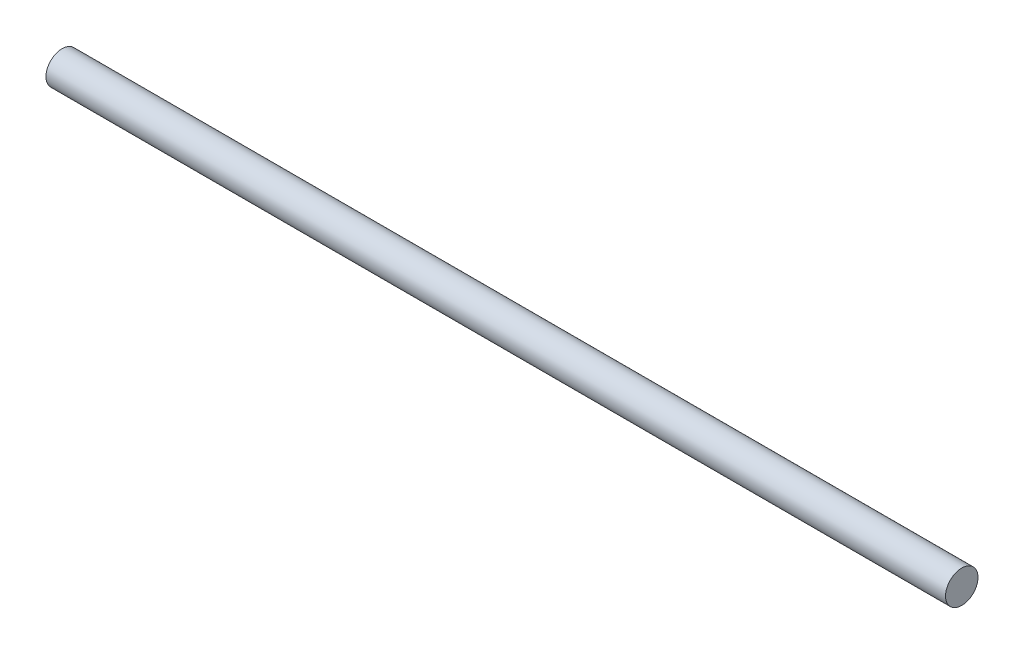
ISO-10303-21;
HEADER;
FILE_DESCRIPTION(('STEP AP214'),'2;1');
FILE_NAME('part.step','',(''),(''),'','','');
FILE_SCHEMA(('AUTOMOTIVE_DESIGN { 1 0 10303 214 1 1 1 1 }'));
ENDSEC;
DATA;
#1=APPLICATION_CONTEXT('core data for automotive mechanical design processes');
#2=APPLICATION_PROTOCOL_DEFINITION('international standard','automotive_design',2000,#1);
#3=PRODUCT_CONTEXT('',#1,'mechanical');
#4=PRODUCT('Part','Part','',(#3));
#5=PRODUCT_RELATED_PRODUCT_CATEGORY('part','',(#4));
#6=PRODUCT_DEFINITION_FORMATION('','',#4);
#7=PRODUCT_DEFINITION_CONTEXT('part definition',#1,'design');
#8=PRODUCT_DEFINITION('design','',#6,#7);
#9=PRODUCT_DEFINITION_SHAPE('','',#8);
#10=(LENGTH_UNIT() NAMED_UNIT(*) SI_UNIT(.MILLI.,.METRE.));
#11=(NAMED_UNIT(*) PLANE_ANGLE_UNIT() SI_UNIT($,.RADIAN.));
#12=(NAMED_UNIT(*) SI_UNIT($,.STERADIAN.) SOLID_ANGLE_UNIT());
#13=UNCERTAINTY_MEASURE_WITH_UNIT(LENGTH_MEASURE(1.E-05),#10,'distance_accuracy_value','');
#14=(GEOMETRIC_REPRESENTATION_CONTEXT(3) GLOBAL_UNCERTAINTY_ASSIGNED_CONTEXT((#13)) GLOBAL_UNIT_ASSIGNED_CONTEXT((#10,
#11,#12)) REPRESENTATION_CONTEXT('',''));
#15=CARTESIAN_POINT('',(0.,0.,0.));
#16=DIRECTION('',(0.,0.,1.));
#17=DIRECTION('',(1.,0.,0.));
#18=AXIS2_PLACEMENT_3D('',#15,#16,#17);
#19=CARTESIAN_POINT('',(1168.4,0.,0.));
#20=DIRECTION('',(-1.,0.,0.));
#21=DIRECTION('',(0.,0.,1.));
#22=AXIS2_PLACEMENT_3D('',#19,#20,#21);
#23=CYLINDRICAL_SURFACE('',#22,21.082);
#24=CARTESIAN_POINT('',(1168.4,0.,0.));
#25=DIRECTION('',(1.,0.,0.));
#26=DIRECTION('',(0.,0.,-1.));
#27=AXIS2_PLACEMENT_3D('',#24,#25,#26);
#28=CIRCLE('',#27,21.082);
#29=CARTESIAN_POINT('',(1168.4,0.,-21.082));
#30=VERTEX_POINT('',#29);
#31=EDGE_CURVE('E10',#30,#30,#28,.T.);
#32=ORIENTED_EDGE('',*,*,#31,.F.);
#33=EDGE_LOOP('',(#32));
#34=FACE_BOUND('',#33,.T.);
#35=CARTESIAN_POINT('',(0.,0.,0.));
#36=DIRECTION('',(1.,0.,0.));
#37=DIRECTION('',(0.,0.,-1.));
#38=AXIS2_PLACEMENT_3D('',#35,#36,#37);
#39=CIRCLE('',#38,21.082);
#40=CARTESIAN_POINT('',(0.,0.,-21.082));
#41=VERTEX_POINT('',#40);
#42=EDGE_CURVE('E40',#41,#41,#39,.T.);
#43=ORIENTED_EDGE('',*,*,#42,.T.);
#44=EDGE_LOOP('',(#43));
#45=FACE_BOUND('',#44,.T.);
#46=ADVANCED_FACE('F37',(#34,#45),#23,.T.);
#47=CARTESIAN_POINT('',(1168.4,0.,0.));
#48=DIRECTION('',(1.,0.,0.));
#49=DIRECTION('',(0.,0.,-1.));
#50=AXIS2_PLACEMENT_3D('',#47,#48,#49);
#51=PLANE('',#50);
#52=ORIENTED_EDGE('',*,*,#31,.T.);
#53=EDGE_LOOP('',(#52));
#54=FACE_BOUND('',#53,.T.);
#55=ADVANCED_FACE('F54',(#54),#51,.T.);
#56=CARTESIAN_POINT('',(0.,0.,0.));
#57=DIRECTION('',(1.,0.,0.));
#58=DIRECTION('',(0.,0.,-1.));
#59=AXIS2_PLACEMENT_3D('',#56,#57,#58);
#60=PLANE('',#59);
#61=ORIENTED_EDGE('',*,*,#42,.F.);
#62=EDGE_LOOP('',(#61));
#63=FACE_BOUND('',#62,.T.);
#64=ADVANCED_FACE('F52',(#63),#60,.F.);
#65=CLOSED_SHELL('',(#46,#55,#64));
#66=MANIFOLD_SOLID_BREP('B2',#65);
#67=ADVANCED_BREP_SHAPE_REPRESENTATION('',(#18,#66),#14);
#68=SHAPE_DEFINITION_REPRESENTATION(#9,#67);
ENDSEC;
END-ISO-10303-21;
